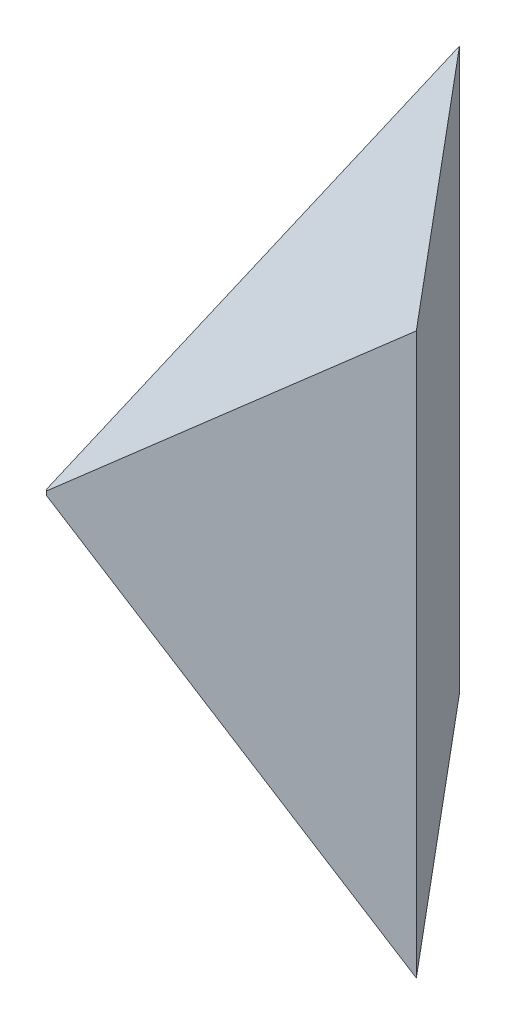
ISO-10303-21;
HEADER;
FILE_DESCRIPTION(('STEP AP214'),'2;1');
FILE_NAME('part.step','',(''),(''),'','','');
FILE_SCHEMA(('AUTOMOTIVE_DESIGN { 1 0 10303 214 1 1 1 1 }'));
ENDSEC;
DATA;
#1=APPLICATION_CONTEXT('core data for automotive mechanical design processes');
#2=APPLICATION_PROTOCOL_DEFINITION('international standard','automotive_design',2000,#1);
#3=PRODUCT_CONTEXT('',#1,'mechanical');
#4=PRODUCT('Part','Part','',(#3));
#5=PRODUCT_RELATED_PRODUCT_CATEGORY('part','',(#4));
#6=PRODUCT_DEFINITION_FORMATION('','',#4);
#7=PRODUCT_DEFINITION_CONTEXT('part definition',#1,'design');
#8=PRODUCT_DEFINITION('design','',#6,#7);
#9=PRODUCT_DEFINITION_SHAPE('','',#8);
#10=(LENGTH_UNIT() NAMED_UNIT(*) SI_UNIT(.MILLI.,.METRE.));
#11=(NAMED_UNIT(*) PLANE_ANGLE_UNIT() SI_UNIT($,.RADIAN.));
#12=(NAMED_UNIT(*) SI_UNIT($,.STERADIAN.) SOLID_ANGLE_UNIT());
#13=UNCERTAINTY_MEASURE_WITH_UNIT(LENGTH_MEASURE(1.E-05),#10,'distance_accuracy_value','');
#14=(GEOMETRIC_REPRESENTATION_CONTEXT(3) GLOBAL_UNCERTAINTY_ASSIGNED_CONTEXT((#13)) GLOBAL_UNIT_ASSIGNED_CONTEXT((#10,
#11,#12)) REPRESENTATION_CONTEXT('',''));
#15=CARTESIAN_POINT('',(0.,0.,0.));
#16=DIRECTION('',(0.,0.,1.));
#17=DIRECTION('',(1.,0.,0.));
#18=AXIS2_PLACEMENT_3D('',#15,#16,#17);
#19=CARTESIAN_POINT('',(551.73169010198,470.46072257174,-112.0108982115));
#20=DIRECTION('',(-0.542147714908736,0.706489444943656,0.454915947623779));
#21=DIRECTION('',(0.642787609686749,0.,0.766044443118802));
#22=AXIS2_PLACEMENT_3D('',#19,#20,#21);
#23=PLANE('',#22);
#24=DIRECTION('',(-0.642787609686799,0.,-0.76604444311876));
#25=VECTOR('',#24,1.);
#26=CARTESIAN_POINT('',(211.19114167393,22.508734270566,177.82301968278));
#27=LINE('',#26,#25);
#28=CARTESIAN_POINT('',(211.19114167393,22.508734270566,177.82301968278));
#29=VERTEX_POINT('',#28);
#30=CARTESIAN_POINT('',(207.16675501746,22.508734270566,173.02694242694));
#31=VERTEX_POINT('',#30);
#32=EDGE_CURVE('E98',#29,#31,#27,.T.);
#33=ORIENTED_EDGE('',*,*,#32,.F.);
#34=DIRECTION('',(-0.754964302462711,-0.647234957258752,0.10543155177296));
#35=VECTOR('',#34,1.);
#36=CARTESIAN_POINT('',(1023.286902266,718.72279787925,64.413000231037));
#37=LINE('',#36,#35);
#38=CARTESIAN_POINT('',(1023.286902266,718.72279787925,64.413000231037));
#39=VERTEX_POINT('',#38);
#40=EDGE_CURVE('E18',#39,#29,#37,.T.);
#41=ORIENTED_EDGE('',*,*,#40,.F.);
#42=DIRECTION('',(0.642787609686799,0.,0.76604444311876));
#43=VECTOR('',#42,1.);
#44=CARTESIAN_POINT('',(459.87277036068,718.72279787925,-607.0378155855));
#45=LINE('',#44,#43);
#46=CARTESIAN_POINT('',(459.87277036068,718.72279787925,-607.0378155855));
#47=VERTEX_POINT('',#46);
#48=EDGE_CURVE('E76',#47,#39,#45,.T.);
#49=ORIENTED_EDGE('',*,*,#48,.F.);
#50=DIRECTION('',(0.234927984924886,0.647234957258685,-0.725186701478647));
#51=VECTOR('',#50,1.);
#52=CARTESIAN_POINT('',(207.16675501746,22.508734270566,173.02694242694));
#53=LINE('',#52,#51);
#54=EDGE_CURVE('E9',#31,#47,#53,.T.);
#55=ORIENTED_EDGE('',*,*,#54,.F.);
#56=EDGE_LOOP('',(#33,#41,#49,#55));
#57=FACE_BOUND('',#56,.T.);
#58=ADVANCED_FACE('F14',(#57),#23,.T.);
#59=CARTESIAN_POINT('',(382.88754364158,17.5,-369.3962138627));
#60=DIRECTION('',(-0.95132582232534,0.,-0.30818692343611));
#61=DIRECTION('',(-0.30818692343611,0.,0.95132582232534));
#62=AXIS2_PLACEMENT_3D('',#59,#60,#61);
#63=PLANE('',#62);
#64=DIRECTION('',(0.,-1.,0.));
#65=VECTOR('',#64,1.);
#66=CARTESIAN_POINT('',(207.16675501746,22.508734270566,173.02694242694));
#67=LINE('',#66,#65);
#68=CARTESIAN_POINT('',(207.16675501746,12.491265729434,173.02694242694));
#69=VERTEX_POINT('',#68);
#70=EDGE_CURVE('E95',#31,#69,#67,.T.);
#71=ORIENTED_EDGE('',*,*,#70,.F.);
#72=ORIENTED_EDGE('',*,*,#54,.T.);
#73=DIRECTION('',(0.,1.,0.));
#74=VECTOR('',#73,1.);
#75=CARTESIAN_POINT('',(459.87277036068,-683.7227978792,-607.0378155855));
#76=LINE('',#75,#74);
#77=CARTESIAN_POINT('',(459.87277036068,-683.7227978792,-607.0378155855));
#78=VERTEX_POINT('',#77);
#79=EDGE_CURVE('E71',#78,#47,#76,.T.);
#80=ORIENTED_EDGE('',*,*,#79,.F.);
#81=DIRECTION('',(0.234927984924886,-0.647234957258685,-0.725186701478647));
#82=VECTOR('',#81,1.);
#83=CARTESIAN_POINT('',(207.16675501746,12.491265729434,173.02694242694));
#84=LINE('',#83,#82);
#85=EDGE_CURVE('E25',#69,#78,#84,.T.);
#86=ORIENTED_EDGE('',*,*,#85,.F.);
#87=EDGE_LOOP('',(#71,#72,#80,#86));
#88=FACE_BOUND('',#87,.T.);
#89=ADVANCED_FACE('F153',(#88),#63,.T.);
#90=CARTESIAN_POINT('',(551.73169010198,-435.4607225717,-112.0108982115));
#91=DIRECTION('',(-0.542147714908736,-0.706489444943656,0.454915947623779));
#92=DIRECTION('',(-0.793332027845354,0.608789202922308,0.));
#93=AXIS2_PLACEMENT_3D('',#90,#91,#92);
#94=PLANE('',#93);
#95=DIRECTION('',(0.642787609686799,0.,0.76604444311876));
#96=VECTOR('',#95,1.);
#97=CARTESIAN_POINT('',(207.16675501746,12.491265729434,173.02694242694));
#98=LINE('',#97,#96);
#99=CARTESIAN_POINT('',(211.19114167393,12.491265729434,177.82301968278));
#100=VERTEX_POINT('',#99);
#101=EDGE_CURVE('E92',#69,#100,#98,.T.);
#102=ORIENTED_EDGE('',*,*,#101,.F.);
#103=ORIENTED_EDGE('',*,*,#85,.T.);
#104=DIRECTION('',(-0.642787609686799,0.,-0.76604444311876));
#105=VECTOR('',#104,1.);
#106=CARTESIAN_POINT('',(1023.286902266,-683.7227978792,64.413000231037));
#107=LINE('',#106,#105);
#108=CARTESIAN_POINT('',(1023.286902266,-683.7227978792,64.413000231037));
#109=VERTEX_POINT('',#108);
#110=EDGE_CURVE('E62',#109,#78,#107,.T.);
#111=ORIENTED_EDGE('',*,*,#110,.F.);
#112=DIRECTION('',(0.754964302462711,-0.647234957258752,-0.10543155177296));
#113=VECTOR('',#112,1.);
#114=CARTESIAN_POINT('',(211.19114167393,12.491265729434,177.82301968278));
#115=LINE('',#114,#113);
#116=EDGE_CURVE('E66',#100,#109,#115,.T.);
#117=ORIENTED_EDGE('',*,*,#116,.F.);
#118=EDGE_LOOP('',(#102,#103,#111,#117));
#119=FACE_BOUND('',#118,.T.);
#120=ADVANCED_FACE('F16',(#119),#94,.T.);
#121=CARTESIAN_POINT('',(741.57983631339,17.5,-271.3124076772));
#122=DIRECTION('',(0.76604444311876,0.,-0.642787609686799));
#123=DIRECTION('',(0.,-1.,0.));
#124=AXIS2_PLACEMENT_3D('',#121,#122,#123);
#125=PLANE('',#124);
#126=DIRECTION('',(0.,-1.,0.));
#127=VECTOR('',#126,1.);
#128=CARTESIAN_POINT('',(1023.286902266,718.72279787925,64.413000231037));
#129=LINE('',#128,#127);
#130=EDGE_CURVE('E74',#39,#109,#129,.T.);
#131=ORIENTED_EDGE('',*,*,#130,.T.);
#132=ORIENTED_EDGE('',*,*,#110,.T.);
#133=ORIENTED_EDGE('',*,*,#79,.T.);
#134=ORIENTED_EDGE('',*,*,#48,.T.);
#135=EDGE_LOOP('',(#131,#132,#133,#134));
#136=FACE_BOUND('',#135,.T.);
#137=ADVANCED_FACE('F75',(#136),#125,.T.);
#138=CARTESIAN_POINT('',(775.8872661241,17.5,98.962617294373));
#139=DIRECTION('',(0.138308876163015,0.,0.990389143102106));
#140=DIRECTION('',(0.,-1.,0.));
#141=AXIS2_PLACEMENT_3D('',#138,#139,#140);
#142=PLANE('',#141);
#143=DIRECTION('',(0.,1.,0.));
#144=VECTOR('',#143,1.);
#145=CARTESIAN_POINT('',(211.19114167393,12.491265729434,177.82301968278));
#146=LINE('',#145,#144);
#147=EDGE_CURVE('E84',#100,#29,#146,.T.);
#148=ORIENTED_EDGE('',*,*,#147,.F.);
#149=ORIENTED_EDGE('',*,*,#116,.T.);
#150=ORIENTED_EDGE('',*,*,#130,.F.);
#151=ORIENTED_EDGE('',*,*,#40,.T.);
#152=EDGE_LOOP('',(#148,#149,#150,#151));
#153=FACE_BOUND('',#152,.T.);
#154=ADVANCED_FACE('F82',(#153),#142,.T.);
#155=CARTESIAN_POINT('',(209.1789483457,17.5,175.42498105486));
#156=DIRECTION('',(-0.76604444311876,0.,0.642787609686799));
#157=DIRECTION('',(0.,1.,0.));
#158=AXIS2_PLACEMENT_3D('',#155,#156,#157);
#159=PLANE('',#158);
#160=ORIENTED_EDGE('',*,*,#32,.T.);
#161=ORIENTED_EDGE('',*,*,#70,.T.);
#162=ORIENTED_EDGE('',*,*,#101,.T.);
#163=ORIENTED_EDGE('',*,*,#147,.T.);
#164=EDGE_LOOP('',(#160,#161,#162,#163));
#165=FACE_BOUND('',#164,.T.);
#166=ADVANCED_FACE('F139',(#165),#159,.T.);
#167=CLOSED_SHELL('',(#58,#89,#120,#137,#154,#166));
#168=MANIFOLD_SOLID_BREP('B1',#167);
#169=ADVANCED_BREP_SHAPE_REPRESENTATION('',(#18,#168),#14);
#170=SHAPE_DEFINITION_REPRESENTATION(#9,#169);
ENDSEC;
END-ISO-10303-21;
